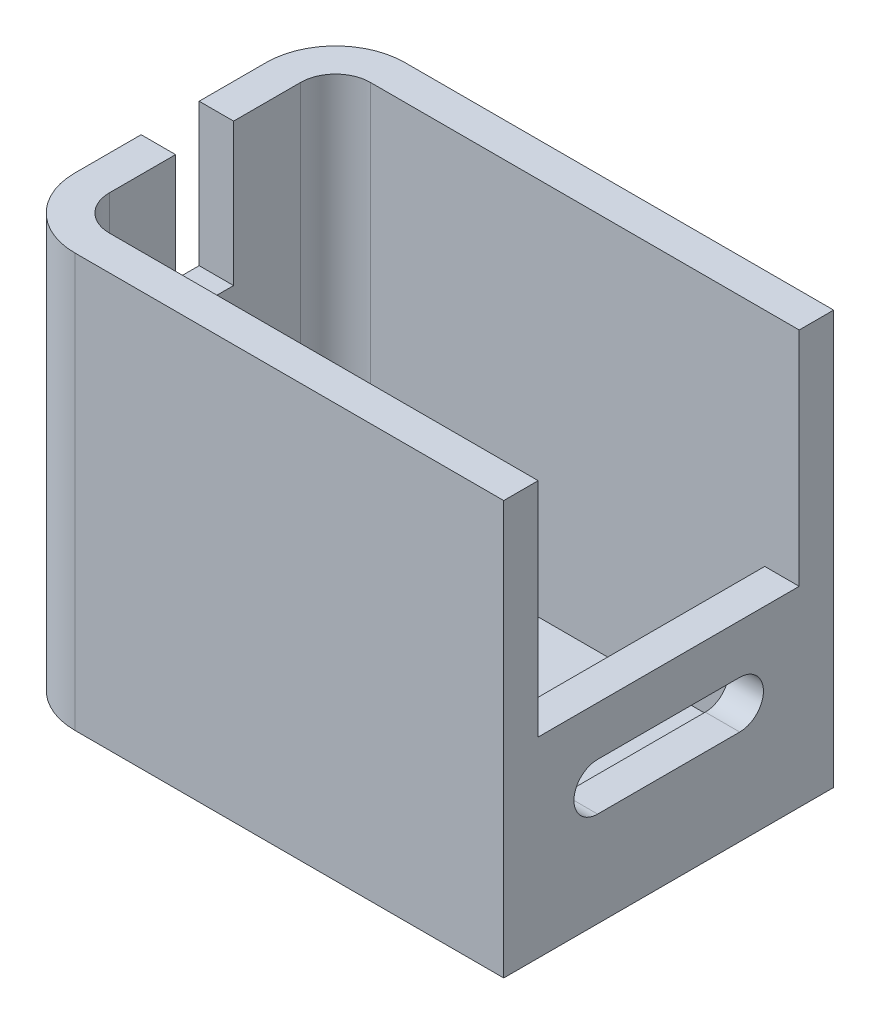
ISO-10303-21;
HEADER;
FILE_DESCRIPTION(('STEP AP214'),'2;1');
FILE_NAME('part.step','',(''),(''),'','','');
FILE_SCHEMA(('AUTOMOTIVE_DESIGN { 1 0 10303 214 1 1 1 1 }'));
ENDSEC;
DATA;
#1=APPLICATION_CONTEXT('core data for automotive mechanical design processes');
#2=APPLICATION_PROTOCOL_DEFINITION('international standard','automotive_design',2000,#1);
#3=PRODUCT_CONTEXT('',#1,'mechanical');
#4=PRODUCT('Part','Part','',(#3));
#5=PRODUCT_RELATED_PRODUCT_CATEGORY('part','',(#4));
#6=PRODUCT_DEFINITION_FORMATION('','',#4);
#7=PRODUCT_DEFINITION_CONTEXT('part definition',#1,'design');
#8=PRODUCT_DEFINITION('design','',#6,#7);
#9=PRODUCT_DEFINITION_SHAPE('','',#8);
#10=(LENGTH_UNIT() NAMED_UNIT(*) SI_UNIT(.MILLI.,.METRE.));
#11=(NAMED_UNIT(*) PLANE_ANGLE_UNIT() SI_UNIT($,.RADIAN.));
#12=(NAMED_UNIT(*) SI_UNIT($,.STERADIAN.) SOLID_ANGLE_UNIT());
#13=UNCERTAINTY_MEASURE_WITH_UNIT(LENGTH_MEASURE(1.E-05),#10,'distance_accuracy_value','');
#14=(GEOMETRIC_REPRESENTATION_CONTEXT(3) GLOBAL_UNCERTAINTY_ASSIGNED_CONTEXT((#13)) GLOBAL_UNIT_ASSIGNED_CONTEXT((#10,
#11,#12)) REPRESENTATION_CONTEXT('',''));
#15=CARTESIAN_POINT('',(0.,0.,0.));
#16=DIRECTION('',(0.,0.,1.));
#17=DIRECTION('',(1.,0.,0.));
#18=AXIS2_PLACEMENT_3D('',#15,#16,#17);
#19=CARTESIAN_POINT('',(0.,33.,-11.3625000000001));
#20=DIRECTION('',(0.,0.,1.));
#21=DIRECTION('',(1.,0.,0.));
#22=AXIS2_PLACEMENT_3D('',#19,#20,#21);
#23=PLANE('',#22);
#24=DIRECTION('',(-1.,0.,0.));
#25=VECTOR('',#24,1.);
#26=CARTESIAN_POINT('',(0.,0.,-11.3625000000001));
#27=LINE('',#26,#25);
#28=CARTESIAN_POINT('',(21.2101905616995,0.,-11.3625000000001));
#29=VERTEX_POINT('',#28);
#30=CARTESIAN_POINT('',(-13.1298094383005,0.,-11.3625000000001));
#31=VERTEX_POINT('',#30);
#32=EDGE_CURVE('E393',#29,#31,#27,.T.);
#33=ORIENTED_EDGE('',*,*,#32,.F.);
#34=DIRECTION('',(0.,-1.,0.));
#35=VECTOR('',#34,1.);
#36=CARTESIAN_POINT('',(21.2101905616995,13.67,-11.3625000000001));
#37=LINE('',#36,#35);
#38=CARTESIAN_POINT('',(21.2101905616995,13.67,-11.3625000000001));
#39=VERTEX_POINT('',#38);
#40=EDGE_CURVE('E291',#39,#29,#37,.T.);
#41=ORIENTED_EDGE('',*,*,#40,.F.);
#42=DIRECTION('',(-1.,0.,0.));
#43=VECTOR('',#42,1.);
#44=CARTESIAN_POINT('',(21.2101905616995,13.67,-11.3625000000001));
#45=LINE('',#44,#43);
#46=CARTESIAN_POINT('',(24.2101905616995,13.67,-11.3625000000001));
#47=VERTEX_POINT('',#46);
#48=EDGE_CURVE('E269',#47,#39,#45,.T.);
#49=ORIENTED_EDGE('',*,*,#48,.F.);
#50=DIRECTION('',(0.,1.,0.));
#51=VECTOR('',#50,1.);
#52=CARTESIAN_POINT('',(24.2101905616995,33.,-11.3625000000001));
#53=LINE('',#52,#51);
#54=CARTESIAN_POINT('',(24.2101905616995,33.,-11.3625000000001));
#55=VERTEX_POINT('',#54);
#56=EDGE_CURVE('E387',#47,#55,#53,.T.);
#57=ORIENTED_EDGE('',*,*,#56,.T.);
#58=DIRECTION('',(-1.,0.,0.));
#59=VECTOR('',#58,1.);
#60=CARTESIAN_POINT('',(0.,33.,-11.3625000000001));
#61=LINE('',#60,#59);
#62=CARTESIAN_POINT('',(-13.1298094383005,33.,-11.3625000000001));
#63=VERTEX_POINT('',#62);
#64=EDGE_CURVE('E394',#55,#63,#61,.T.);
#65=ORIENTED_EDGE('',*,*,#64,.T.);
#66=DIRECTION('',(0.,-1.,0.));
#67=VECTOR('',#66,1.);
#68=CARTESIAN_POINT('',(-13.1298094383005,33.,-11.3625000000001));
#69=LINE('',#68,#67);
#70=EDGE_CURVE('E440',#63,#31,#69,.T.);
#71=ORIENTED_EDGE('',*,*,#70,.T.);
#72=EDGE_LOOP('',(#33,#41,#49,#57,#65,#71));
#73=FACE_BOUND('',#72,.T.);
#74=ADVANCED_FACE('F47',(#73),#23,.T.);
#75=CARTESIAN_POINT('',(0.,33.,11.3625000000001));
#76=DIRECTION('',(0.,0.,1.));
#77=DIRECTION('',(1.,0.,0.));
#78=AXIS2_PLACEMENT_3D('',#75,#76,#77);
#79=PLANE('',#78);
#80=DIRECTION('',(0.,-1.,0.));
#81=VECTOR('',#80,1.);
#82=CARTESIAN_POINT('',(21.2101905616995,13.67,11.3625000000001));
#83=LINE('',#82,#81);
#84=CARTESIAN_POINT('',(21.2101905616995,13.67,11.3625000000001));
#85=VERTEX_POINT('',#84);
#86=CARTESIAN_POINT('',(21.2101905616995,0.,11.3625000000001));
#87=VERTEX_POINT('',#86);
#88=EDGE_CURVE('E285',#85,#87,#83,.T.);
#89=ORIENTED_EDGE('',*,*,#88,.T.);
#90=DIRECTION('',(-1.,0.,0.));
#91=VECTOR('',#90,1.);
#92=CARTESIAN_POINT('',(0.,0.,11.3625000000001));
#93=LINE('',#92,#91);
#94=CARTESIAN_POINT('',(-13.1298094383005,0.,11.3625000000001));
#95=VERTEX_POINT('',#94);
#96=EDGE_CURVE('E398',#87,#95,#93,.T.);
#97=ORIENTED_EDGE('',*,*,#96,.T.);
#98=DIRECTION('',(0.,-1.,0.));
#99=VECTOR('',#98,1.);
#100=CARTESIAN_POINT('',(-13.1298094383005,33.,11.3625000000001));
#101=LINE('',#100,#99);
#102=CARTESIAN_POINT('',(-13.1298094383005,33.,11.3625000000001));
#103=VERTEX_POINT('',#102);
#104=EDGE_CURVE('E414',#103,#95,#101,.T.);
#105=ORIENTED_EDGE('',*,*,#104,.F.);
#106=DIRECTION('',(-1.,0.,0.));
#107=VECTOR('',#106,1.);
#108=CARTESIAN_POINT('',(0.,33.,11.3625000000001));
#109=LINE('',#108,#107);
#110=CARTESIAN_POINT('',(24.2101905616995,33.,11.3625000000001));
#111=VERTEX_POINT('',#110);
#112=EDGE_CURVE('E410',#111,#103,#109,.T.);
#113=ORIENTED_EDGE('',*,*,#112,.F.);
#114=DIRECTION('',(0.,-1.,0.));
#115=VECTOR('',#114,1.);
#116=CARTESIAN_POINT('',(24.2101905616995,33.,11.3625000000001));
#117=LINE('',#116,#115);
#118=CARTESIAN_POINT('',(24.2101905616995,13.67,11.3625000000001));
#119=VERTEX_POINT('',#118);
#120=EDGE_CURVE('E390',#111,#119,#117,.T.);
#121=ORIENTED_EDGE('',*,*,#120,.T.);
#122=DIRECTION('',(1.,0.,0.));
#123=VECTOR('',#122,1.);
#124=CARTESIAN_POINT('',(24.2101905616995,13.67,11.3625000000001));
#125=LINE('',#124,#123);
#126=EDGE_CURVE('E277',#85,#119,#125,.T.);
#127=ORIENTED_EDGE('',*,*,#126,.F.);
#128=EDGE_LOOP('',(#89,#97,#105,#113,#121,#127));
#129=FACE_BOUND('',#128,.T.);
#130=ADVANCED_FACE('F545',(#129),#79,.F.);
#131=CARTESIAN_POINT('',(0.,0.,0.));
#132=DIRECTION('',(0.,1.,0.));
#133=DIRECTION('',(0.,0.,1.));
#134=AXIS2_PLACEMENT_3D('',#131,#132,#133);
#135=PLANE('',#134);
#136=ORIENTED_EDGE('',*,*,#96,.F.);
#137=DIRECTION('',(0.,0.,1.));
#138=VECTOR('',#137,1.);
#139=CARTESIAN_POINT('',(21.2101905616995,0.,11.3625000000001));
#140=LINE('',#139,#138);
#141=EDGE_CURVE('E264',#29,#87,#140,.T.);
#142=ORIENTED_EDGE('',*,*,#141,.F.);
#143=ORIENTED_EDGE('',*,*,#32,.T.);
#144=CARTESIAN_POINT('',(-13.1298094383005,0.,-8.33250000000013));
#145=DIRECTION('',(0.,1.,0.));
#146=DIRECTION('',(0.,0.,1.));
#147=AXIS2_PLACEMENT_3D('',#144,#145,#146);
#148=CIRCLE('',#147,3.03);
#149=CARTESIAN_POINT('',(-16.1598094383005,0.,-8.33250000000011));
#150=VERTEX_POINT('',#149);
#151=EDGE_CURVE('E417',#31,#150,#148,.T.);
#152=ORIENTED_EDGE('',*,*,#151,.T.);
#153=DIRECTION('',(0.,0.,1.));
#154=VECTOR('',#153,1.);
#155=CARTESIAN_POINT('',(-16.1598094383005,0.,0.));
#156=LINE('',#155,#154);
#157=CARTESIAN_POINT('',(-16.1598094383005,0.,8.33250000000011));
#158=VERTEX_POINT('',#157);
#159=EDGE_CURVE('E420',#150,#158,#156,.T.);
#160=ORIENTED_EDGE('',*,*,#159,.T.);
#161=CARTESIAN_POINT('',(-13.1298094383005,0.,8.33250000000013));
#162=DIRECTION('',(0.,1.,0.));
#163=DIRECTION('',(0.,0.,1.));
#164=AXIS2_PLACEMENT_3D('',#161,#162,#163);
#165=CIRCLE('',#164,3.03);
#166=EDGE_CURVE('E424',#95,#158,#165,.F.);
#167=ORIENTED_EDGE('',*,*,#166,.F.);
#168=EDGE_LOOP('',(#136,#142,#143,#152,#160,#167));
#169=FACE_BOUND('',#168,.T.);
#170=ADVANCED_FACE('F552',(#169),#135,.T.);
#171=CARTESIAN_POINT('',(0.,33.,0.));
#172=DIRECTION('',(0.,1.,0.));
#173=DIRECTION('',(0.,0.,1.));
#174=AXIS2_PLACEMENT_3D('',#171,#172,#173);
#175=PLANE('',#174);
#176=DIRECTION('',(0.,0.,1.));
#177=VECTOR('',#176,1.);
#178=CARTESIAN_POINT('',(-16.1598094383005,33.,0.));
#179=LINE('',#178,#177);
#180=CARTESIAN_POINT('',(-16.1598094383005,33.,2.56143509653007));
#181=VERTEX_POINT('',#180);
#182=CARTESIAN_POINT('',(-16.1598094383005,33.,8.33250000000011));
#183=VERTEX_POINT('',#182);
#184=EDGE_CURVE('E401',#181,#183,#179,.T.);
#185=ORIENTED_EDGE('',*,*,#184,.F.);
#186=DIRECTION('',(-1.,0.,0.));
#187=VECTOR('',#186,1.);
#188=CARTESIAN_POINT('',(0.,33.,2.56143509653007));
#189=LINE('',#188,#187);
#190=CARTESIAN_POINT('',(-19.1598094383005,33.,2.56143509653007));
#191=VERTEX_POINT('',#190);
#192=EDGE_CURVE('E373',#181,#191,#189,.T.);
#193=ORIENTED_EDGE('',*,*,#192,.T.);
#194=DIRECTION('',(0.,0.,1.));
#195=VECTOR('',#194,1.);
#196=CARTESIAN_POINT('',(-19.1598094383005,33.,0.));
#197=LINE('',#196,#195);
#198=CARTESIAN_POINT('',(-19.1598094383005,33.,8.33250000000011));
#199=VERTEX_POINT('',#198);
#200=EDGE_CURVE('E496',#191,#199,#197,.T.);
#201=ORIENTED_EDGE('',*,*,#200,.T.);
#202=CARTESIAN_POINT('',(-13.1298094383005,33.,8.33250000000013));
#203=DIRECTION('',(0.,1.,0.));
#204=DIRECTION('',(0.,0.,1.));
#205=AXIS2_PLACEMENT_3D('',#202,#203,#204);
#206=CIRCLE('',#205,6.03);
#207=CARTESIAN_POINT('',(-13.1298094383004,33.,14.3625000000001));
#208=VERTEX_POINT('',#207);
#209=EDGE_CURVE('E501',#208,#199,#206,.F.);
#210=ORIENTED_EDGE('',*,*,#209,.F.);
#211=DIRECTION('',(-1.,0.,0.));
#212=VECTOR('',#211,1.);
#213=CARTESIAN_POINT('',(0.,33.,14.3625000000001));
#214=LINE('',#213,#212);
#215=CARTESIAN_POINT('',(24.2101905616995,33.,14.3625000000001));
#216=VERTEX_POINT('',#215);
#217=EDGE_CURVE('E505',#216,#208,#214,.T.);
#218=ORIENTED_EDGE('',*,*,#217,.F.);
#219=DIRECTION('',(0.,0.,1.));
#220=VECTOR('',#219,1.);
#221=CARTESIAN_POINT('',(24.2101905616995,33.,0.));
#222=LINE('',#221,#220);
#223=EDGE_CURVE('E509',#111,#216,#222,.T.);
#224=ORIENTED_EDGE('',*,*,#223,.F.);
#225=ORIENTED_EDGE('',*,*,#112,.T.);
#226=CARTESIAN_POINT('',(-13.1298094383005,33.,8.33250000000013));
#227=DIRECTION('',(0.,1.,0.));
#228=DIRECTION('',(0.,0.,1.));
#229=AXIS2_PLACEMENT_3D('',#226,#227,#228);
#230=CIRCLE('',#229,3.03);
#231=EDGE_CURVE('E406',#103,#183,#230,.F.);
#232=ORIENTED_EDGE('',*,*,#231,.T.);
#233=EDGE_LOOP('',(#185,#193,#201,#210,#218,#224,#225,#232));
#234=FACE_BOUND('',#233,.T.);
#235=ADVANCED_FACE('F564',(#234),#175,.T.);
#236=CARTESIAN_POINT('',(0.,33.,-14.3625000000001));
#237=DIRECTION('',(0.,0.,1.));
#238=DIRECTION('',(1.,0.,0.));
#239=AXIS2_PLACEMENT_3D('',#236,#237,#238);
#240=PLANE('',#239);
#241=DIRECTION('',(-1.,0.,0.));
#242=VECTOR('',#241,1.);
#243=CARTESIAN_POINT('',(0.,-3.,-14.3625000000001));
#244=LINE('',#243,#242);
#245=CARTESIAN_POINT('',(24.2101905616995,-3.,-14.3625000000001));
#246=VERTEX_POINT('',#245);
#247=CARTESIAN_POINT('',(-13.1298094383004,-3.,-14.3625000000001));
#248=VERTEX_POINT('',#247);
#249=EDGE_CURVE('E444',#246,#248,#244,.T.);
#250=ORIENTED_EDGE('',*,*,#249,.T.);
#251=DIRECTION('',(0.,-1.,0.));
#252=VECTOR('',#251,1.);
#253=CARTESIAN_POINT('',(-13.1298094383004,33.,-14.3625000000001));
#254=LINE('',#253,#252);
#255=CARTESIAN_POINT('',(-13.1298094383004,33.,-14.3625000000001));
#256=VERTEX_POINT('',#255);
#257=EDGE_CURVE('E449',#256,#248,#254,.T.);
#258=ORIENTED_EDGE('',*,*,#257,.F.);
#259=DIRECTION('',(-1.,0.,0.));
#260=VECTOR('',#259,1.);
#261=CARTESIAN_POINT('',(0.,33.,-14.3625000000001));
#262=LINE('',#261,#260);
#263=CARTESIAN_POINT('',(24.2101905616995,33.,-14.3625000000001));
#264=VERTEX_POINT('',#263);
#265=EDGE_CURVE('E489',#264,#256,#262,.T.);
#266=ORIENTED_EDGE('',*,*,#265,.F.);
#267=DIRECTION('',(0.,-1.,0.));
#268=VECTOR('',#267,1.);
#269=CARTESIAN_POINT('',(24.2101905616995,33.,-14.3625000000001));
#270=LINE('',#269,#268);
#271=EDGE_CURVE('E455',#264,#246,#270,.T.);
#272=ORIENTED_EDGE('',*,*,#271,.T.);
#273=EDGE_LOOP('',(#250,#258,#266,#272));
#274=FACE_BOUND('',#273,.T.);
#275=ADVANCED_FACE('F565',(#274),#240,.F.);
#276=CARTESIAN_POINT('',(-13.1298094383005,33.,-8.33250000000013));
#277=DIRECTION('',(0.,-1.,0.));
#278=DIRECTION('',(0.,0.,-1.));
#279=AXIS2_PLACEMENT_3D('',#276,#277,#278);
#280=CYLINDRICAL_SURFACE('',#279,6.03);
#281=CARTESIAN_POINT('',(-13.1298094383005,-3.,-8.33250000000013));
#282=DIRECTION('',(0.,1.,0.));
#283=DIRECTION('',(0.,0.,1.));
#284=AXIS2_PLACEMENT_3D('',#281,#282,#283);
#285=CIRCLE('',#284,6.03);
#286=CARTESIAN_POINT('',(-19.1598094383005,-3.,-8.33250000000011));
#287=VERTEX_POINT('',#286);
#288=EDGE_CURVE('E448',#248,#287,#285,.T.);
#289=ORIENTED_EDGE('',*,*,#288,.T.);
#290=DIRECTION('',(0.,1.,0.));
#291=VECTOR('',#290,1.);
#292=CARTESIAN_POINT('',(-19.1598094383005,33.,-8.33250000000011));
#293=LINE('',#292,#291);
#294=CARTESIAN_POINT('',(-19.1598094383005,33.,-8.33250000000009));
#295=VERTEX_POINT('',#294);
#296=EDGE_CURVE('E454',#295,#287,#293,.F.);
#297=ORIENTED_EDGE('',*,*,#296,.F.);
#298=CARTESIAN_POINT('',(-13.1298094383005,33.,-8.33250000000013));
#299=DIRECTION('',(0.,1.,0.));
#300=DIRECTION('',(0.,0.,1.));
#301=AXIS2_PLACEMENT_3D('',#298,#299,#300);
#302=CIRCLE('',#301,6.03);
#303=EDGE_CURVE('E493',#256,#295,#302,.T.);
#304=ORIENTED_EDGE('',*,*,#303,.F.);
#305=ORIENTED_EDGE('',*,*,#257,.T.);
#306=EDGE_LOOP('',(#289,#297,#304,#305));
#307=FACE_BOUND('',#306,.T.);
#308=ADVANCED_FACE('F568',(#307),#280,.T.);
#309=CARTESIAN_POINT('',(-19.1598094383005,33.,0.));
#310=DIRECTION('',(1.,0.,0.));
#311=DIRECTION('',(0.,0.,-1.));
#312=AXIS2_PLACEMENT_3D('',#309,#310,#311);
#313=PLANE('',#312);
#314=DIRECTION('',(0.,0.,1.));
#315=VECTOR('',#314,1.);
#316=CARTESIAN_POINT('',(-19.1598094383005,20.6,0.));
#317=LINE('',#316,#315);
#318=CARTESIAN_POINT('',(-19.1598094383005,20.6,-2.48856490346993));
#319=VERTEX_POINT('',#318);
#320=CARTESIAN_POINT('',(-19.1598094383005,20.6,2.56143509653007));
#321=VERTEX_POINT('',#320);
#322=EDGE_CURVE('E370',#319,#321,#317,.T.);
#323=ORIENTED_EDGE('',*,*,#322,.F.);
#324=DIRECTION('',(0.,1.,0.));
#325=VECTOR('',#324,1.);
#326=CARTESIAN_POINT('',(-19.1598094383005,33.,-2.48856490346993));
#327=LINE('',#326,#325);
#328=CARTESIAN_POINT('',(-19.1598094383005,33.,-2.48856490346993));
#329=VERTEX_POINT('',#328);
#330=EDGE_CURVE('E383',#319,#329,#327,.T.);
#331=ORIENTED_EDGE('',*,*,#330,.T.);
#332=EDGE_CURVE('E497',#295,#329,#197,.T.);
#333=ORIENTED_EDGE('',*,*,#332,.F.);
#334=ORIENTED_EDGE('',*,*,#296,.T.);
#335=DIRECTION('',(0.,0.,1.));
#336=VECTOR('',#335,1.);
#337=CARTESIAN_POINT('',(-19.1598094383005,-3.,0.));
#338=LINE('',#337,#336);
#339=CARTESIAN_POINT('',(-19.1598094383005,-3.,8.33250000000009));
#340=VERTEX_POINT('',#339);
#341=EDGE_CURVE('E462',#287,#340,#338,.T.);
#342=ORIENTED_EDGE('',*,*,#341,.T.);
#343=DIRECTION('',(0.,-1.,0.));
#344=VECTOR('',#343,1.);
#345=CARTESIAN_POINT('',(-19.1598094383005,33.,8.33250000000009));
#346=LINE('',#345,#344);
#347=EDGE_CURVE('E466',#199,#340,#346,.T.);
#348=ORIENTED_EDGE('',*,*,#347,.F.);
#349=ORIENTED_EDGE('',*,*,#200,.F.);
#350=DIRECTION('',(0.,1.,0.));
#351=VECTOR('',#350,1.);
#352=CARTESIAN_POINT('',(-19.1598094383005,33.,2.56143509653007));
#353=LINE('',#352,#351);
#354=EDGE_CURVE('E377',#321,#191,#353,.T.);
#355=ORIENTED_EDGE('',*,*,#354,.F.);
#356=EDGE_LOOP('',(#323,#331,#333,#334,#342,#348,#349,#355));
#357=FACE_BOUND('',#356,.T.);
#358=ADVANCED_FACE('F572',(#357),#313,.F.);
#359=CARTESIAN_POINT('',(-13.1298094383005,33.,8.33250000000013));
#360=DIRECTION('',(0.,-1.,0.));
#361=DIRECTION('',(0.,0.,-1.));
#362=AXIS2_PLACEMENT_3D('',#359,#360,#361);
#363=CYLINDRICAL_SURFACE('',#362,6.03);
#364=CARTESIAN_POINT('',(-13.1298094383005,-3.,8.33250000000013));
#365=DIRECTION('',(0.,1.,0.));
#366=DIRECTION('',(0.,0.,1.));
#367=AXIS2_PLACEMENT_3D('',#364,#365,#366);
#368=CIRCLE('',#367,6.03);
#369=CARTESIAN_POINT('',(-13.1298094383005,-3.,14.3625000000001));
#370=VERTEX_POINT('',#369);
#371=EDGE_CURVE('E470',#370,#340,#368,.F.);
#372=ORIENTED_EDGE('',*,*,#371,.F.);
#373=DIRECTION('',(0.,1.,0.));
#374=VECTOR('',#373,1.);
#375=CARTESIAN_POINT('',(-13.1298094383005,33.,14.3625000000001));
#376=LINE('',#375,#374);
#377=EDGE_CURVE('E473',#208,#370,#376,.F.);
#378=ORIENTED_EDGE('',*,*,#377,.F.);
#379=ORIENTED_EDGE('',*,*,#209,.T.);
#380=ORIENTED_EDGE('',*,*,#347,.T.);
#381=EDGE_LOOP('',(#372,#378,#379,#380));
#382=FACE_BOUND('',#381,.T.);
#383=ADVANCED_FACE('F576',(#382),#363,.T.);
#384=CARTESIAN_POINT('',(0.,33.,14.3625000000001));
#385=DIRECTION('',(0.,0.,1.));
#386=DIRECTION('',(1.,0.,0.));
#387=AXIS2_PLACEMENT_3D('',#384,#385,#386);
#388=PLANE('',#387);
#389=DIRECTION('',(-1.,0.,0.));
#390=VECTOR('',#389,1.);
#391=CARTESIAN_POINT('',(0.,-3.,14.3625000000001));
#392=LINE('',#391,#390);
#393=CARTESIAN_POINT('',(24.2101905616995,-3.,14.3625000000001));
#394=VERTEX_POINT('',#393);
#395=EDGE_CURVE('E477',#394,#370,#392,.T.);
#396=ORIENTED_EDGE('',*,*,#395,.F.);
#397=DIRECTION('',(0.,-1.,0.));
#398=VECTOR('',#397,1.);
#399=CARTESIAN_POINT('',(24.2101905616995,33.,14.3625000000001));
#400=LINE('',#399,#398);
#401=EDGE_CURVE('E458',#216,#394,#400,.T.);
#402=ORIENTED_EDGE('',*,*,#401,.F.);
#403=ORIENTED_EDGE('',*,*,#217,.T.);
#404=ORIENTED_EDGE('',*,*,#377,.T.);
#405=EDGE_LOOP('',(#396,#402,#403,#404));
#406=FACE_BOUND('',#405,.T.);
#407=ADVANCED_FACE('F580',(#406),#388,.T.);
#408=CARTESIAN_POINT('',(24.2101905616995,33.,0.));
#409=DIRECTION('',(1.,0.,0.));
#410=DIRECTION('',(0.,0.,-1.));
#411=AXIS2_PLACEMENT_3D('',#408,#409,#410);
#412=PLANE('',#411);
#413=CARTESIAN_POINT('',(24.2101905616995,7.33360824255927,6.18594271230319));
#414=DIRECTION('',(1.,0.,0.));
#415=DIRECTION('',(0.,0.,-1.));
#416=AXIS2_PLACEMENT_3D('',#413,#414,#415);
#417=CIRCLE('',#416,2.06198090410106);
#418=CARTESIAN_POINT('',(24.2101905616995,9.39558914666033,6.18594271230319));
#419=VERTEX_POINT('',#418);
#420=CARTESIAN_POINT('',(24.2101905616995,5.27162733845821,6.18594271230319));
#421=VERTEX_POINT('',#420);
#422=EDGE_CURVE('E63',#419,#421,#417,.T.);
#423=ORIENTED_EDGE('',*,*,#422,.F.);
#424=DIRECTION('',(0.,0.,1.));
#425=VECTOR('',#424,1.);
#426=CARTESIAN_POINT('',(24.2101905616995,9.39558914666033,6.18594271230319));
#427=LINE('',#426,#425);
#428=CARTESIAN_POINT('',(24.2101905616995,9.39558914666033,-6.18594271230319));
#429=VERTEX_POINT('',#428);
#430=EDGE_CURVE('E254',#429,#419,#427,.T.);
#431=ORIENTED_EDGE('',*,*,#430,.F.);
#432=CARTESIAN_POINT('',(24.2101905616995,7.33360824255927,-6.18594271230319));
#433=DIRECTION('',(1.,0.,0.));
#434=DIRECTION('',(0.,0.,-1.));
#435=AXIS2_PLACEMENT_3D('',#432,#433,#434);
#436=CIRCLE('',#435,2.06198090410106);
#437=CARTESIAN_POINT('',(24.2101905616995,5.27162733845821,-6.18594271230319));
#438=VERTEX_POINT('',#437);
#439=EDGE_CURVE('E236',#438,#429,#436,.T.);
#440=ORIENTED_EDGE('',*,*,#439,.F.);
#441=DIRECTION('',(0.,0.,-1.));
#442=VECTOR('',#441,1.);
#443=CARTESIAN_POINT('',(24.2101905616995,5.27162733845821,6.18594271230319));
#444=LINE('',#443,#442);
#445=EDGE_CURVE('E246',#421,#438,#444,.T.);
#446=ORIENTED_EDGE('',*,*,#445,.F.);
#447=EDGE_LOOP('',(#423,#431,#440,#446));
#448=FACE_BOUND('',#447,.T.);
#449=ORIENTED_EDGE('',*,*,#56,.F.);
#450=DIRECTION('',(0.,0.,-1.));
#451=VECTOR('',#450,1.);
#452=CARTESIAN_POINT('',(24.2101905616995,13.67,-11.3625000000001));
#453=LINE('',#452,#451);
#454=EDGE_CURVE('E281',#119,#47,#453,.T.);
#455=ORIENTED_EDGE('',*,*,#454,.F.);
#456=ORIENTED_EDGE('',*,*,#120,.F.);
#457=ORIENTED_EDGE('',*,*,#223,.T.);
#458=ORIENTED_EDGE('',*,*,#401,.T.);
#459=DIRECTION('',(0.,0.,1.));
#460=VECTOR('',#459,1.);
#461=CARTESIAN_POINT('',(24.2101905616995,-3.,0.));
#462=LINE('',#461,#460);
#463=EDGE_CURVE('E483',#246,#394,#462,.T.);
#464=ORIENTED_EDGE('',*,*,#463,.F.);
#465=ORIENTED_EDGE('',*,*,#271,.F.);
#466=EDGE_CURVE('E459',#264,#55,#222,.T.);
#467=ORIENTED_EDGE('',*,*,#466,.T.);
#468=EDGE_LOOP('',(#449,#455,#456,#457,#458,#464,#465,#467));
#469=FACE_BOUND('',#468,.T.);
#470=ADVANCED_FACE('F251',(#448,#469),#412,.T.);
#471=DIRECTION('',(-1.,0.,0.));
#472=VECTOR('',#471,1.);
#473=CARTESIAN_POINT('',(0.,33.,-2.48856490346993));
#474=LINE('',#473,#472);
#475=CARTESIAN_POINT('',(-16.1598094383005,33.,-2.48856490346993));
#476=VERTEX_POINT('',#475);
#477=EDGE_CURVE('E380',#476,#329,#474,.T.);
#478=ORIENTED_EDGE('',*,*,#477,.F.);
#479=CARTESIAN_POINT('',(-16.1598094383005,33.,-8.33250000000011));
#480=VERTEX_POINT('',#479);
#481=EDGE_CURVE('E402',#480,#476,#179,.T.);
#482=ORIENTED_EDGE('',*,*,#481,.F.);
#483=CARTESIAN_POINT('',(-13.1298094383005,33.,-8.33250000000013));
#484=DIRECTION('',(0.,1.,0.));
#485=DIRECTION('',(0.,0.,1.));
#486=AXIS2_PLACEMENT_3D('',#483,#484,#485);
#487=CIRCLE('',#486,3.03);
#488=EDGE_CURVE('E397',#63,#480,#487,.T.);
#489=ORIENTED_EDGE('',*,*,#488,.F.);
#490=ORIENTED_EDGE('',*,*,#64,.F.);
#491=ORIENTED_EDGE('',*,*,#466,.F.);
#492=ORIENTED_EDGE('',*,*,#265,.T.);
#493=ORIENTED_EDGE('',*,*,#303,.T.);
#494=ORIENTED_EDGE('',*,*,#332,.T.);
#495=EDGE_LOOP('',(#478,#482,#489,#490,#491,#492,#493,#494));
#496=FACE_BOUND('',#495,.T.);
#497=ADVANCED_FACE('F560',(#496),#175,.T.);
#498=CARTESIAN_POINT('',(0.,-3.,0.));
#499=DIRECTION('',(0.,1.,0.));
#500=DIRECTION('',(0.,0.,1.));
#501=AXIS2_PLACEMENT_3D('',#498,#499,#500);
#502=PLANE('',#501);
#503=DIRECTION('',(0.,0.,1.));
#504=VECTOR('',#503,1.);
#505=CARTESIAN_POINT('',(21.2101905616995,-3.,0.));
#506=LINE('',#505,#504);
#507=CARTESIAN_POINT('',(21.2101905616995,-3.,-11.3625000000001));
#508=VERTEX_POINT('',#507);
#509=CARTESIAN_POINT('',(21.2101905616995,-3.,11.3625000000001));
#510=VERTEX_POINT('',#509);
#511=EDGE_CURVE('E353',#508,#510,#506,.T.);
#512=ORIENTED_EDGE('',*,*,#511,.F.);
#513=DIRECTION('',(-1.,0.,0.));
#514=VECTOR('',#513,1.);
#515=CARTESIAN_POINT('',(0.,-3.,-11.3625000000001));
#516=LINE('',#515,#514);
#517=CARTESIAN_POINT('',(-13.1298094383005,-3.,-11.3625000000001));
#518=VERTEX_POINT('',#517);
#519=EDGE_CURVE('E356',#508,#518,#516,.T.);
#520=ORIENTED_EDGE('',*,*,#519,.T.);
#521=CARTESIAN_POINT('',(-13.1298094383005,-3.,-8.33250000000013));
#522=DIRECTION('',(0.,1.,0.));
#523=DIRECTION('',(0.,0.,1.));
#524=AXIS2_PLACEMENT_3D('',#521,#522,#523);
#525=CIRCLE('',#524,3.03);
#526=CARTESIAN_POINT('',(-16.1598094383005,-3.,-8.33250000000011));
#527=VERTEX_POINT('',#526);
#528=EDGE_CURVE('E321',#518,#527,#525,.T.);
#529=ORIENTED_EDGE('',*,*,#528,.T.);
#530=DIRECTION('',(0.,0.,1.));
#531=VECTOR('',#530,1.);
#532=CARTESIAN_POINT('',(-16.1598094383005,-3.,0.));
#533=LINE('',#532,#531);
#534=CARTESIAN_POINT('',(-16.1598094383005,-3.,8.33250000000011));
#535=VERTEX_POINT('',#534);
#536=EDGE_CURVE('E343',#527,#535,#533,.T.);
#537=ORIENTED_EDGE('',*,*,#536,.T.);
#538=CARTESIAN_POINT('',(-13.1298094383005,-3.,8.33250000000013));
#539=DIRECTION('',(0.,1.,0.));
#540=DIRECTION('',(0.,0.,1.));
#541=AXIS2_PLACEMENT_3D('',#538,#539,#540);
#542=CIRCLE('',#541,3.03);
#543=CARTESIAN_POINT('',(-13.1298094383005,-3.,11.3625000000001));
#544=VERTEX_POINT('',#543);
#545=EDGE_CURVE('E347',#544,#535,#542,.F.);
#546=ORIENTED_EDGE('',*,*,#545,.F.);
#547=DIRECTION('',(-1.,0.,0.));
#548=VECTOR('',#547,1.);
#549=CARTESIAN_POINT('',(0.,-3.,11.3625000000001));
#550=LINE('',#549,#548);
#551=EDGE_CURVE('E350',#510,#544,#550,.T.);
#552=ORIENTED_EDGE('',*,*,#551,.F.);
#553=EDGE_LOOP('',(#512,#520,#529,#537,#546,#552));
#554=FACE_BOUND('',#553,.T.);
#555=ORIENTED_EDGE('',*,*,#249,.F.);
#556=ORIENTED_EDGE('',*,*,#463,.T.);
#557=ORIENTED_EDGE('',*,*,#395,.T.);
#558=ORIENTED_EDGE('',*,*,#371,.T.);
#559=ORIENTED_EDGE('',*,*,#341,.F.);
#560=ORIENTED_EDGE('',*,*,#288,.F.);
#561=EDGE_LOOP('',(#555,#556,#557,#558,#559,#560));
#562=FACE_BOUND('',#561,.T.);
#563=ADVANCED_FACE('F49',(#554,#562),#502,.F.);
#564=CARTESIAN_POINT('',(-13.1298094383005,33.,-8.33250000000013));
#565=DIRECTION('',(0.,-1.,0.));
#566=DIRECTION('',(0.,0.,-1.));
#567=AXIS2_PLACEMENT_3D('',#564,#565,#566);
#568=CYLINDRICAL_SURFACE('',#567,3.03);
#569=ORIENTED_EDGE('',*,*,#151,.F.);
#570=ORIENTED_EDGE('',*,*,#70,.F.);
#571=ORIENTED_EDGE('',*,*,#488,.T.);
#572=DIRECTION('',(0.,-1.,0.));
#573=VECTOR('',#572,1.);
#574=CARTESIAN_POINT('',(-16.1598094383005,33.,-8.33250000000011));
#575=LINE('',#574,#573);
#576=EDGE_CURVE('E436',#480,#150,#575,.T.);
#577=ORIENTED_EDGE('',*,*,#576,.T.);
#578=EDGE_LOOP('',(#569,#570,#571,#577));
#579=FACE_BOUND('',#578,.T.);
#580=ADVANCED_FACE('F558',(#579),#568,.F.);
#581=CARTESIAN_POINT('',(-16.1598094383005,33.,0.));
#582=DIRECTION('',(1.,0.,0.));
#583=DIRECTION('',(0.,0.,-1.));
#584=AXIS2_PLACEMENT_3D('',#581,#582,#583);
#585=PLANE('',#584);
#586=DIRECTION('',(0.,1.,0.));
#587=VECTOR('',#586,1.);
#588=CARTESIAN_POINT('',(-16.1598094383005,33.,-2.48856490346993));
#589=LINE('',#588,#587);
#590=CARTESIAN_POINT('',(-16.1598094383005,20.6,-2.48856490346993));
#591=VERTEX_POINT('',#590);
#592=EDGE_CURVE('E516',#591,#476,#589,.T.);
#593=ORIENTED_EDGE('',*,*,#592,.F.);
#594=DIRECTION('',(0.,0.,1.));
#595=VECTOR('',#594,1.);
#596=CARTESIAN_POINT('',(-16.1598094383005,20.6,0.));
#597=LINE('',#596,#595);
#598=CARTESIAN_POINT('',(-16.1598094383005,20.6,2.56143509653007));
#599=VERTEX_POINT('',#598);
#600=EDGE_CURVE('E366',#591,#599,#597,.T.);
#601=ORIENTED_EDGE('',*,*,#600,.T.);
#602=DIRECTION('',(0.,1.,0.));
#603=VECTOR('',#602,1.);
#604=CARTESIAN_POINT('',(-16.1598094383005,33.,2.56143509653007));
#605=LINE('',#604,#603);
#606=EDGE_CURVE('E453',#599,#181,#605,.T.);
#607=ORIENTED_EDGE('',*,*,#606,.T.);
#608=ORIENTED_EDGE('',*,*,#184,.T.);
#609=DIRECTION('',(0.,-1.,0.));
#610=VECTOR('',#609,1.);
#611=CARTESIAN_POINT('',(-16.1598094383005,33.,8.33250000000011));
#612=LINE('',#611,#610);
#613=EDGE_CURVE('E433',#183,#158,#612,.T.);
#614=ORIENTED_EDGE('',*,*,#613,.T.);
#615=ORIENTED_EDGE('',*,*,#159,.F.);
#616=ORIENTED_EDGE('',*,*,#576,.F.);
#617=ORIENTED_EDGE('',*,*,#481,.T.);
#618=EDGE_LOOP('',(#593,#601,#607,#608,#614,#615,#616,#617));
#619=FACE_BOUND('',#618,.T.);
#620=ADVANCED_FACE('F754',(#619),#585,.T.);
#621=CARTESIAN_POINT('',(-13.1298094383005,33.,8.33250000000013));
#622=DIRECTION('',(0.,-1.,0.));
#623=DIRECTION('',(0.,0.,-1.));
#624=AXIS2_PLACEMENT_3D('',#621,#622,#623);
#625=CYLINDRICAL_SURFACE('',#624,3.03);
#626=ORIENTED_EDGE('',*,*,#166,.T.);
#627=ORIENTED_EDGE('',*,*,#613,.F.);
#628=ORIENTED_EDGE('',*,*,#231,.F.);
#629=ORIENTED_EDGE('',*,*,#104,.T.);
#630=EDGE_LOOP('',(#626,#627,#628,#629));
#631=FACE_BOUND('',#630,.T.);
#632=ADVANCED_FACE('F736',(#631),#625,.F.);
#633=CARTESIAN_POINT('',(0.,53.6,-2.48856490346993));
#634=DIRECTION('',(0.,0.,-1.));
#635=DIRECTION('',(-1.,0.,0.));
#636=AXIS2_PLACEMENT_3D('',#633,#634,#635);
#637=PLANE('',#636);
#638=DIRECTION('',(1.,0.,0.));
#639=VECTOR('',#638,1.);
#640=CARTESIAN_POINT('',(0.,20.6,-2.48856490346993));
#641=LINE('',#640,#639);
#642=EDGE_CURVE('E360',#319,#591,#641,.T.);
#643=ORIENTED_EDGE('',*,*,#642,.T.);
#644=ORIENTED_EDGE('',*,*,#592,.T.);
#645=ORIENTED_EDGE('',*,*,#477,.T.);
#646=ORIENTED_EDGE('',*,*,#330,.F.);
#647=EDGE_LOOP('',(#643,#644,#645,#646));
#648=FACE_BOUND('',#647,.T.);
#649=ADVANCED_FACE('F727',(#648),#637,.F.);
#650=CARTESIAN_POINT('',(0.,53.6,2.56143509653007));
#651=DIRECTION('',(0.,0.,-1.));
#652=DIRECTION('',(-1.,0.,0.));
#653=AXIS2_PLACEMENT_3D('',#650,#651,#652);
#654=PLANE('',#653);
#655=ORIENTED_EDGE('',*,*,#354,.T.);
#656=ORIENTED_EDGE('',*,*,#192,.F.);
#657=ORIENTED_EDGE('',*,*,#606,.F.);
#658=DIRECTION('',(1.,0.,0.));
#659=VECTOR('',#658,1.);
#660=CARTESIAN_POINT('',(0.,20.6,2.56143509653007));
#661=LINE('',#660,#659);
#662=EDGE_CURVE('E363',#321,#599,#661,.T.);
#663=ORIENTED_EDGE('',*,*,#662,.F.);
#664=EDGE_LOOP('',(#655,#656,#657,#663));
#665=FACE_BOUND('',#664,.T.);
#666=ADVANCED_FACE('F718',(#665),#654,.T.);
#667=CARTESIAN_POINT('',(0.,20.6,0.));
#668=DIRECTION('',(0.,1.,0.));
#669=DIRECTION('',(0.,0.,1.));
#670=AXIS2_PLACEMENT_3D('',#667,#668,#669);
#671=PLANE('',#670);
#672=ORIENTED_EDGE('',*,*,#322,.T.);
#673=ORIENTED_EDGE('',*,*,#662,.T.);
#674=ORIENTED_EDGE('',*,*,#600,.F.);
#675=ORIENTED_EDGE('',*,*,#642,.F.);
#676=EDGE_LOOP('',(#672,#673,#674,#675));
#677=FACE_BOUND('',#676,.T.);
#678=ADVANCED_FACE('F709',(#677),#671,.T.);
#679=CARTESIAN_POINT('',(0.,-4.,-11.3625000000001));
#680=DIRECTION('',(0.,0.,-1.));
#681=DIRECTION('',(-1.,0.,0.));
#682=AXIS2_PLACEMENT_3D('',#679,#680,#681);
#683=PLANE('',#682);
#684=ORIENTED_EDGE('',*,*,#519,.F.);
#685=DIRECTION('',(0.,1.,0.));
#686=VECTOR('',#685,1.);
#687=CARTESIAN_POINT('',(21.2101905616995,-4.,-11.3625000000001));
#688=LINE('',#687,#686);
#689=CARTESIAN_POINT('',(21.2101905616995,-4.,-11.3625000000001));
#690=VERTEX_POINT('',#689);
#691=EDGE_CURVE('E317',#690,#508,#688,.T.);
#692=ORIENTED_EDGE('',*,*,#691,.F.);
#693=DIRECTION('',(-1.,0.,0.));
#694=VECTOR('',#693,1.);
#695=CARTESIAN_POINT('',(0.,-4.,-11.3625000000001));
#696=LINE('',#695,#694);
#697=CARTESIAN_POINT('',(-13.1298094383005,-4.,-11.3625000000001));
#698=VERTEX_POINT('',#697);
#699=EDGE_CURVE('E295',#690,#698,#696,.T.);
#700=ORIENTED_EDGE('',*,*,#699,.T.);
#701=DIRECTION('',(0.,1.,0.));
#702=VECTOR('',#701,1.);
#703=CARTESIAN_POINT('',(-13.1298094383005,-4.,-11.3625000000001));
#704=LINE('',#703,#702);
#705=EDGE_CURVE('E316',#698,#518,#704,.T.);
#706=ORIENTED_EDGE('',*,*,#705,.T.);
#707=EDGE_LOOP('',(#684,#692,#700,#706));
#708=FACE_BOUND('',#707,.T.);
#709=ADVANCED_FACE('F700',(#708),#683,.T.);
#710=CARTESIAN_POINT('',(21.2101905616995,-4.,0.));
#711=DIRECTION('',(-1.,0.,0.));
#712=DIRECTION('',(0.,0.,1.));
#713=AXIS2_PLACEMENT_3D('',#710,#711,#712);
#714=PLANE('',#713);
#715=ORIENTED_EDGE('',*,*,#691,.T.);
#716=ORIENTED_EDGE('',*,*,#511,.T.);
#717=DIRECTION('',(0.,1.,0.));
#718=VECTOR('',#717,1.);
#719=CARTESIAN_POINT('',(21.2101905616995,-4.,11.3625000000001));
#720=LINE('',#719,#718);
#721=CARTESIAN_POINT('',(21.2101905616995,-4.,11.3625000000001));
#722=VERTEX_POINT('',#721);
#723=EDGE_CURVE('E322',#722,#510,#720,.T.);
#724=ORIENTED_EDGE('',*,*,#723,.F.);
#725=DIRECTION('',(0.,0.,1.));
#726=VECTOR('',#725,1.);
#727=CARTESIAN_POINT('',(21.2101905616995,-4.,0.));
#728=LINE('',#727,#726);
#729=EDGE_CURVE('E313',#690,#722,#728,.T.);
#730=ORIENTED_EDGE('',*,*,#729,.F.);
#731=EDGE_LOOP('',(#715,#716,#724,#730));
#732=FACE_BOUND('',#731,.T.);
#733=ADVANCED_FACE('F691',(#732),#714,.F.);
#734=CARTESIAN_POINT('',(0.,-4.,11.3625000000001));
#735=DIRECTION('',(0.,0.,-1.));
#736=DIRECTION('',(-1.,0.,0.));
#737=AXIS2_PLACEMENT_3D('',#734,#735,#736);
#738=PLANE('',#737);
#739=ORIENTED_EDGE('',*,*,#723,.T.);
#740=ORIENTED_EDGE('',*,*,#551,.T.);
#741=DIRECTION('',(0.,1.,0.));
#742=VECTOR('',#741,1.);
#743=CARTESIAN_POINT('',(-13.1298094383005,-4.,11.3625000000001));
#744=LINE('',#743,#742);
#745=CARTESIAN_POINT('',(-13.1298094383005,-4.,11.3625000000001));
#746=VERTEX_POINT('',#745);
#747=EDGE_CURVE('E326',#746,#544,#744,.T.);
#748=ORIENTED_EDGE('',*,*,#747,.F.);
#749=DIRECTION('',(-1.,0.,0.));
#750=VECTOR('',#749,1.);
#751=CARTESIAN_POINT('',(0.,-4.,11.3625000000001));
#752=LINE('',#751,#750);
#753=EDGE_CURVE('E310',#722,#746,#752,.T.);
#754=ORIENTED_EDGE('',*,*,#753,.F.);
#755=EDGE_LOOP('',(#739,#740,#748,#754));
#756=FACE_BOUND('',#755,.T.);
#757=ADVANCED_FACE('F682',(#756),#738,.F.);
#758=CARTESIAN_POINT('',(-13.1298094383005,-4.,8.33250000000013));
#759=DIRECTION('',(0.,1.,0.));
#760=DIRECTION('',(0.,0.,1.));
#761=AXIS2_PLACEMENT_3D('',#758,#759,#760);
#762=CYLINDRICAL_SURFACE('',#761,3.03);
#763=ORIENTED_EDGE('',*,*,#747,.T.);
#764=ORIENTED_EDGE('',*,*,#545,.T.);
#765=DIRECTION('',(0.,1.,0.));
#766=VECTOR('',#765,1.);
#767=CARTESIAN_POINT('',(-16.1598094383005,-4.,8.33250000000011));
#768=LINE('',#767,#766);
#769=CARTESIAN_POINT('',(-16.1598094383005,-4.,8.33250000000011));
#770=VERTEX_POINT('',#769);
#771=EDGE_CURVE('E330',#770,#535,#768,.T.);
#772=ORIENTED_EDGE('',*,*,#771,.F.);
#773=CARTESIAN_POINT('',(-13.1298094383005,-4.,8.33250000000013));
#774=DIRECTION('',(0.,1.,0.));
#775=DIRECTION('',(0.,0.,1.));
#776=AXIS2_PLACEMENT_3D('',#773,#774,#775);
#777=CIRCLE('',#776,3.03);
#778=EDGE_CURVE('E307',#746,#770,#777,.F.);
#779=ORIENTED_EDGE('',*,*,#778,.F.);
#780=EDGE_LOOP('',(#763,#764,#772,#779));
#781=FACE_BOUND('',#780,.T.);
#782=ADVANCED_FACE('F673',(#781),#762,.T.);
#783=CARTESIAN_POINT('',(-16.1598094383005,-4.,0.));
#784=DIRECTION('',(-1.,0.,0.));
#785=DIRECTION('',(0.,0.,1.));
#786=AXIS2_PLACEMENT_3D('',#783,#784,#785);
#787=PLANE('',#786);
#788=ORIENTED_EDGE('',*,*,#536,.F.);
#789=DIRECTION('',(0.,1.,0.));
#790=VECTOR('',#789,1.);
#791=CARTESIAN_POINT('',(-16.1598094383005,-4.,-8.33250000000011));
#792=LINE('',#791,#790);
#793=CARTESIAN_POINT('',(-16.1598094383005,-4.,-8.33250000000011));
#794=VERTEX_POINT('',#793);
#795=EDGE_CURVE('E334',#794,#527,#792,.T.);
#796=ORIENTED_EDGE('',*,*,#795,.F.);
#797=DIRECTION('',(0.,0.,1.));
#798=VECTOR('',#797,1.);
#799=CARTESIAN_POINT('',(-16.1598094383005,-4.,0.));
#800=LINE('',#799,#798);
#801=EDGE_CURVE('E303',#794,#770,#800,.T.);
#802=ORIENTED_EDGE('',*,*,#801,.T.);
#803=ORIENTED_EDGE('',*,*,#771,.T.);
#804=EDGE_LOOP('',(#788,#796,#802,#803));
#805=FACE_BOUND('',#804,.T.);
#806=ADVANCED_FACE('F664',(#805),#787,.T.);
#807=CARTESIAN_POINT('',(-13.1298094383005,-4.,-8.33250000000013));
#808=DIRECTION('',(0.,1.,0.));
#809=DIRECTION('',(0.,0.,1.));
#810=AXIS2_PLACEMENT_3D('',#807,#808,#809);
#811=CYLINDRICAL_SURFACE('',#810,3.03);
#812=ORIENTED_EDGE('',*,*,#528,.F.);
#813=ORIENTED_EDGE('',*,*,#705,.F.);
#814=CARTESIAN_POINT('',(-13.1298094383005,-4.,-8.33250000000013));
#815=DIRECTION('',(0.,1.,0.));
#816=DIRECTION('',(0.,0.,1.));
#817=AXIS2_PLACEMENT_3D('',#814,#815,#816);
#818=CIRCLE('',#817,3.03);
#819=EDGE_CURVE('E299',#698,#794,#818,.T.);
#820=ORIENTED_EDGE('',*,*,#819,.T.);
#821=ORIENTED_EDGE('',*,*,#795,.T.);
#822=EDGE_LOOP('',(#812,#813,#820,#821));
#823=FACE_BOUND('',#822,.T.);
#824=ADVANCED_FACE('F655',(#823),#811,.T.);
#825=CARTESIAN_POINT('',(0.,-4.,0.));
#826=DIRECTION('',(0.,1.,0.));
#827=DIRECTION('',(0.,0.,1.));
#828=AXIS2_PLACEMENT_3D('',#825,#826,#827);
#829=PLANE('',#828);
#830=ORIENTED_EDGE('',*,*,#699,.F.);
#831=ORIENTED_EDGE('',*,*,#729,.T.);
#832=ORIENTED_EDGE('',*,*,#753,.T.);
#833=ORIENTED_EDGE('',*,*,#778,.T.);
#834=ORIENTED_EDGE('',*,*,#801,.F.);
#835=ORIENTED_EDGE('',*,*,#819,.F.);
#836=EDGE_LOOP('',(#830,#831,#832,#833,#834,#835));
#837=FACE_BOUND('',#836,.T.);
#838=ADVANCED_FACE('F596',(#837),#829,.F.);
#839=CARTESIAN_POINT('',(21.2101905616995,13.67,11.3625000000001));
#840=DIRECTION('',(1.,0.,0.));
#841=DIRECTION('',(0.,0.,-1.));
#842=AXIS2_PLACEMENT_3D('',#839,#840,#841);
#843=PLANE('',#842);
#844=DIRECTION('',(0.,0.,1.));
#845=VECTOR('',#844,1.);
#846=CARTESIAN_POINT('',(21.2101905616995,9.39558914666033,11.3625000000001));
#847=LINE('',#846,#845);
#848=CARTESIAN_POINT('',(21.2101905616995,9.39558914666033,-6.18594271230319));
#849=VERTEX_POINT('',#848);
#850=CARTESIAN_POINT('',(21.2101905616995,9.39558914666033,6.18594271230319));
#851=VERTEX_POINT('',#850);
#852=EDGE_CURVE('E56',#849,#851,#847,.T.);
#853=ORIENTED_EDGE('',*,*,#852,.T.);
#854=CARTESIAN_POINT('',(21.2101905616995,7.33360824255927,6.18594271230319));
#855=DIRECTION('',(1.,0.,0.));
#856=DIRECTION('',(0.,0.,-1.));
#857=AXIS2_PLACEMENT_3D('',#854,#855,#856);
#858=CIRCLE('',#857,2.06198090410106);
#859=CARTESIAN_POINT('',(21.2101905616995,5.27162733845821,6.18594271230319));
#860=VERTEX_POINT('',#859);
#861=EDGE_CURVE('E11',#851,#860,#858,.T.);
#862=ORIENTED_EDGE('',*,*,#861,.T.);
#863=DIRECTION('',(0.,0.,-1.));
#864=VECTOR('',#863,1.);
#865=CARTESIAN_POINT('',(21.2101905616995,5.27162733845821,11.3625000000001));
#866=LINE('',#865,#864);
#867=CARTESIAN_POINT('',(21.2101905616995,5.27162733845821,-6.18594271230319));
#868=VERTEX_POINT('',#867);
#869=EDGE_CURVE('E519',#860,#868,#866,.T.);
#870=ORIENTED_EDGE('',*,*,#869,.T.);
#871=CARTESIAN_POINT('',(21.2101905616995,7.33360824255927,-6.18594271230319));
#872=DIRECTION('',(1.,0.,0.));
#873=DIRECTION('',(0.,0.,-1.));
#874=AXIS2_PLACEMENT_3D('',#871,#872,#873);
#875=CIRCLE('',#874,2.06198090410106);
#876=EDGE_CURVE('E239',#868,#849,#875,.T.);
#877=ORIENTED_EDGE('',*,*,#876,.T.);
#878=EDGE_LOOP('',(#853,#862,#870,#877));
#879=FACE_BOUND('',#878,.T.);
#880=ORIENTED_EDGE('',*,*,#141,.T.);
#881=ORIENTED_EDGE('',*,*,#88,.F.);
#882=DIRECTION('',(0.,0.,1.));
#883=VECTOR('',#882,1.);
#884=CARTESIAN_POINT('',(21.2101905616995,13.67,11.3625000000001));
#885=LINE('',#884,#883);
#886=EDGE_CURVE('E273',#39,#85,#885,.T.);
#887=ORIENTED_EDGE('',*,*,#886,.F.);
#888=ORIENTED_EDGE('',*,*,#40,.T.);
#889=EDGE_LOOP('',(#880,#881,#887,#888));
#890=FACE_BOUND('',#889,.T.);
#891=ADVANCED_FACE('F526',(#879,#890),#843,.F.);
#892=CARTESIAN_POINT('',(0.,13.67,0.));
#893=DIRECTION('',(0.,-1.,0.));
#894=DIRECTION('',(0.,0.,-1.));
#895=AXIS2_PLACEMENT_3D('',#892,#893,#894);
#896=PLANE('',#895);
#897=ORIENTED_EDGE('',*,*,#48,.T.);
#898=ORIENTED_EDGE('',*,*,#886,.T.);
#899=ORIENTED_EDGE('',*,*,#126,.T.);
#900=ORIENTED_EDGE('',*,*,#454,.T.);
#901=EDGE_LOOP('',(#897,#898,#899,#900));
#902=FACE_BOUND('',#901,.T.);
#903=ADVANCED_FACE('F533',(#902),#896,.F.);
#904=CARTESIAN_POINT('',(10.5401905616995,7.33360824255927,6.18594271230319));
#905=DIRECTION('',(1.,0.,0.));
#906=DIRECTION('',(0.,0.,-1.));
#907=AXIS2_PLACEMENT_3D('',#904,#905,#906);
#908=CYLINDRICAL_SURFACE('',#907,2.06198090410106);
#909=DIRECTION('',(1.,0.,0.));
#910=VECTOR('',#909,1.);
#911=CARTESIAN_POINT('',(10.5401905616995,9.39558914666033,6.18594271230319));
#912=LINE('',#911,#910);
#913=EDGE_CURVE('E261',#851,#419,#912,.T.);
#914=ORIENTED_EDGE('',*,*,#913,.T.);
#915=ORIENTED_EDGE('',*,*,#422,.T.);
#916=DIRECTION('',(1.,0.,0.));
#917=VECTOR('',#916,1.);
#918=CARTESIAN_POINT('',(10.5401905616995,5.27162733845821,6.18594271230319));
#919=LINE('',#918,#917);
#920=EDGE_CURVE('E243',#860,#421,#919,.T.);
#921=ORIENTED_EDGE('',*,*,#920,.F.);
#922=ORIENTED_EDGE('',*,*,#861,.F.);
#923=EDGE_LOOP('',(#914,#915,#921,#922));
#924=FACE_BOUND('',#923,.T.);
#925=ADVANCED_FACE('F531',(#924),#908,.F.);
#926=CARTESIAN_POINT('',(10.5401905616995,9.39558914666033,6.18594271230319));
#927=DIRECTION('',(0.,1.,0.));
#928=DIRECTION('',(0.,0.,1.));
#929=AXIS2_PLACEMENT_3D('',#926,#927,#928);
#930=PLANE('',#929);
#931=DIRECTION('',(1.,0.,0.));
#932=VECTOR('',#931,1.);
#933=CARTESIAN_POINT('',(10.5401905616995,9.39558914666033,-6.18594271230319));
#934=LINE('',#933,#932);
#935=EDGE_CURVE('E242',#849,#429,#934,.T.);
#936=ORIENTED_EDGE('',*,*,#935,.T.);
#937=ORIENTED_EDGE('',*,*,#430,.T.);
#938=ORIENTED_EDGE('',*,*,#913,.F.);
#939=ORIENTED_EDGE('',*,*,#852,.F.);
#940=EDGE_LOOP('',(#936,#937,#938,#939));
#941=FACE_BOUND('',#940,.T.);
#942=ADVANCED_FACE('F530',(#941),#930,.F.);
#943=CARTESIAN_POINT('',(10.5401905616995,7.33360824255927,-6.18594271230319));
#944=DIRECTION('',(1.,0.,0.));
#945=DIRECTION('',(0.,0.,-1.));
#946=AXIS2_PLACEMENT_3D('',#943,#944,#945);
#947=CYLINDRICAL_SURFACE('',#946,2.06198090410106);
#948=DIRECTION('',(1.,0.,0.));
#949=VECTOR('',#948,1.);
#950=CARTESIAN_POINT('',(10.5401905616995,5.27162733845821,-6.18594271230319));
#951=LINE('',#950,#949);
#952=EDGE_CURVE('E71',#868,#438,#951,.T.);
#953=ORIENTED_EDGE('',*,*,#952,.T.);
#954=ORIENTED_EDGE('',*,*,#439,.T.);
#955=ORIENTED_EDGE('',*,*,#935,.F.);
#956=ORIENTED_EDGE('',*,*,#876,.F.);
#957=EDGE_LOOP('',(#953,#954,#955,#956));
#958=FACE_BOUND('',#957,.T.);
#959=ADVANCED_FACE('F233',(#958),#947,.F.);
#960=CARTESIAN_POINT('',(10.5401905616995,5.27162733845821,6.18594271230319));
#961=DIRECTION('',(0.,-1.,0.));
#962=DIRECTION('',(0.,0.,-1.));
#963=AXIS2_PLACEMENT_3D('',#960,#961,#962);
#964=PLANE('',#963);
#965=ORIENTED_EDGE('',*,*,#920,.T.);
#966=ORIENTED_EDGE('',*,*,#445,.T.);
#967=ORIENTED_EDGE('',*,*,#952,.F.);
#968=ORIENTED_EDGE('',*,*,#869,.F.);
#969=EDGE_LOOP('',(#965,#966,#967,#968));
#970=FACE_BOUND('',#969,.T.);
#971=ADVANCED_FACE('F247',(#970),#964,.F.);
#972=CLOSED_SHELL('',(#74,#130,#170,#235,#275,#308,#358,#383,#407,#470,#497,#563,#580,#620,#632,
#649,#666,#678,#709,#733,#757,#782,#806,#824,#838,#891,#903,#925,#942,#959,#971));
#973=MANIFOLD_SOLID_BREP('B2',#972);
#974=ADVANCED_BREP_SHAPE_REPRESENTATION('',(#18,#973),#14);
#975=SHAPE_DEFINITION_REPRESENTATION(#9,#974);
ENDSEC;
END-ISO-10303-21;
